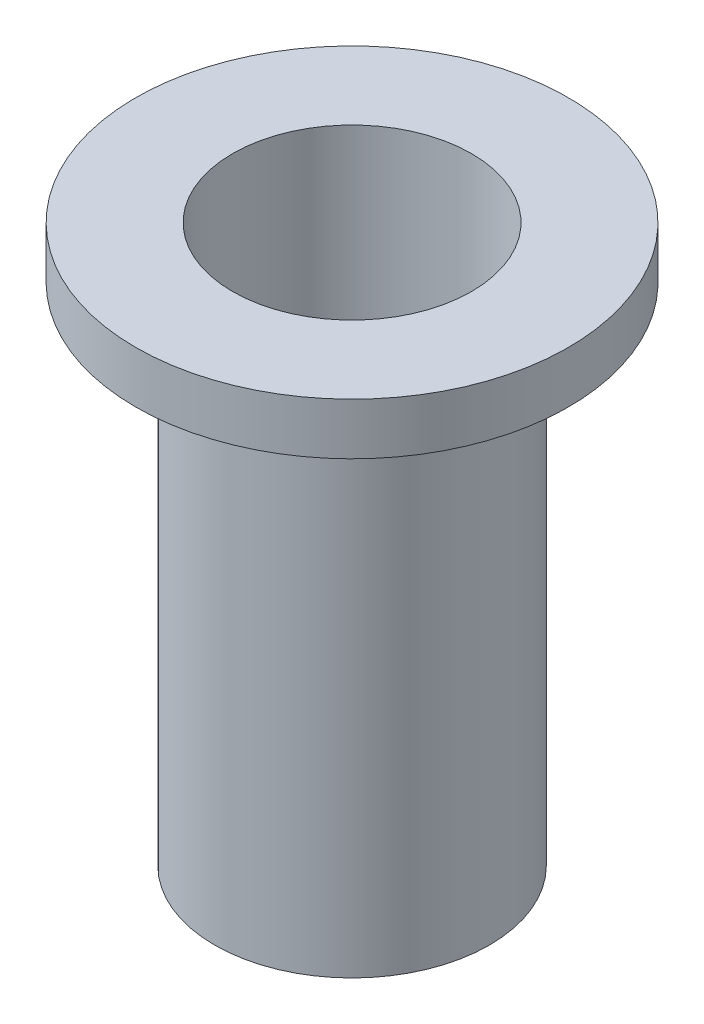
ISO-10303-21;
HEADER;
FILE_DESCRIPTION(('STEP AP214'),'2;1');
FILE_NAME('part.step','',(''),(''),'','','');
FILE_SCHEMA(('AUTOMOTIVE_DESIGN { 1 0 10303 214 1 1 1 1 }'));
ENDSEC;
DATA;
#1=APPLICATION_CONTEXT('core data for automotive mechanical design processes');
#2=APPLICATION_PROTOCOL_DEFINITION('international standard','automotive_design',2000,#1);
#3=PRODUCT_CONTEXT('',#1,'mechanical');
#4=PRODUCT('Part','Part','',(#3));
#5=PRODUCT_RELATED_PRODUCT_CATEGORY('part','',(#4));
#6=PRODUCT_DEFINITION_FORMATION('','',#4);
#7=PRODUCT_DEFINITION_CONTEXT('part definition',#1,'design');
#8=PRODUCT_DEFINITION('design','',#6,#7);
#9=PRODUCT_DEFINITION_SHAPE('','',#8);
#10=(LENGTH_UNIT() NAMED_UNIT(*) SI_UNIT(.MILLI.,.METRE.));
#11=(NAMED_UNIT(*) PLANE_ANGLE_UNIT() SI_UNIT($,.RADIAN.));
#12=(NAMED_UNIT(*) SI_UNIT($,.STERADIAN.) SOLID_ANGLE_UNIT());
#13=UNCERTAINTY_MEASURE_WITH_UNIT(LENGTH_MEASURE(1.E-05),#10,'distance_accuracy_value','');
#14=(GEOMETRIC_REPRESENTATION_CONTEXT(3) GLOBAL_UNCERTAINTY_ASSIGNED_CONTEXT((#13)) GLOBAL_UNIT_ASSIGNED_CONTEXT((#10,
#11,#12)) REPRESENTATION_CONTEXT('',''));
#15=CARTESIAN_POINT('',(0.,0.,0.));
#16=DIRECTION('',(0.,0.,1.));
#17=DIRECTION('',(1.,0.,0.));
#18=AXIS2_PLACEMENT_3D('',#15,#16,#17);
#19=CARTESIAN_POINT('',(0.,0.,0.));
#20=DIRECTION('',(0.,1.,0.));
#21=DIRECTION('',(0.,0.,1.));
#22=AXIS2_PLACEMENT_3D('',#19,#20,#21);
#23=PLANE('',#22);
#24=CARTESIAN_POINT('',(0.,0.,0.));
#25=DIRECTION('',(0.,1.,0.));
#26=DIRECTION('',(0.,0.,1.));
#27=AXIS2_PLACEMENT_3D('',#24,#25,#26);
#28=CIRCLE('',#27,12.7);
#29=CARTESIAN_POINT('',(0.,0.,12.7));
#30=VERTEX_POINT('',#29);
#31=EDGE_CURVE('E34',#30,#30,#28,.T.);
#32=ORIENTED_EDGE('',*,*,#31,.F.);
#33=EDGE_LOOP('',(#32));
#34=FACE_BOUND('',#33,.T.);
#35=CARTESIAN_POINT('',(0.,0.,0.));
#36=DIRECTION('',(0.,1.,0.));
#37=DIRECTION('',(0.,0.,1.));
#38=AXIS2_PLACEMENT_3D('',#35,#36,#37);
#39=CIRCLE('',#38,11.049);
#40=CARTESIAN_POINT('',(0.,0.,11.049));
#41=VERTEX_POINT('',#40);
#42=EDGE_CURVE('E41',#41,#41,#39,.T.);
#43=ORIENTED_EDGE('',*,*,#42,.T.);
#44=EDGE_LOOP('',(#43));
#45=FACE_BOUND('',#44,.T.);
#46=ADVANCED_FACE('F30',(#34,#45),#23,.F.);
#47=CARTESIAN_POINT('',(0.,46.736,0.));
#48=DIRECTION('',(0.,-1.,0.));
#49=DIRECTION('',(0.,0.,-1.));
#50=AXIS2_PLACEMENT_3D('',#47,#48,#49);
#51=CYLINDRICAL_SURFACE('',#50,12.7);
#52=CARTESIAN_POINT('',(0.,46.736,0.));
#53=DIRECTION('',(0.,1.,0.));
#54=DIRECTION('',(0.,0.,1.));
#55=AXIS2_PLACEMENT_3D('',#52,#53,#54);
#56=CIRCLE('',#55,12.7);
#57=CARTESIAN_POINT('',(0.,46.736,12.7));
#58=VERTEX_POINT('',#57);
#59=EDGE_CURVE('E10',#58,#58,#56,.T.);
#60=ORIENTED_EDGE('',*,*,#59,.F.);
#61=EDGE_LOOP('',(#60));
#62=FACE_BOUND('',#61,.T.);
#63=ORIENTED_EDGE('',*,*,#31,.T.);
#64=EDGE_LOOP('',(#63));
#65=FACE_BOUND('',#64,.T.);
#66=ADVANCED_FACE('F32',(#62,#65),#51,.T.);
#67=CARTESIAN_POINT('',(0.,46.736,0.));
#68=DIRECTION('',(0.,-1.,0.));
#69=DIRECTION('',(0.,0.,-1.));
#70=AXIS2_PLACEMENT_3D('',#67,#68,#69);
#71=CYLINDRICAL_SURFACE('',#70,11.049);
#72=ORIENTED_EDGE('',*,*,#42,.F.);
#73=EDGE_LOOP('',(#72));
#74=FACE_BOUND('',#73,.T.);
#75=CARTESIAN_POINT('',(0.,51.5112,0.));
#76=DIRECTION('',(0.,1.,0.));
#77=DIRECTION('',(0.,0.,1.));
#78=AXIS2_PLACEMENT_3D('',#75,#76,#77);
#79=CIRCLE('',#78,11.049);
#80=CARTESIAN_POINT('',(0.,51.5112,11.049));
#81=VERTEX_POINT('',#80);
#82=EDGE_CURVE('E49',#81,#81,#79,.T.);
#83=ORIENTED_EDGE('',*,*,#82,.T.);
#84=EDGE_LOOP('',(#83));
#85=FACE_BOUND('',#84,.T.);
#86=ADVANCED_FACE('F55',(#74,#85),#71,.F.);
#87=CARTESIAN_POINT('',(0.,46.736,0.));
#88=DIRECTION('',(0.,1.,0.));
#89=DIRECTION('',(0.,0.,1.));
#90=AXIS2_PLACEMENT_3D('',#87,#88,#89);
#91=PLANE('',#90);
#92=CARTESIAN_POINT('',(0.,46.736,0.));
#93=DIRECTION('',(0.,1.,0.));
#94=DIRECTION('',(0.,0.,1.));
#95=AXIS2_PLACEMENT_3D('',#92,#93,#94);
#96=CIRCLE('',#95,20.0025);
#97=CARTESIAN_POINT('',(0.,46.736,20.0025));
#98=VERTEX_POINT('',#97);
#99=EDGE_CURVE('E46',#98,#98,#96,.T.);
#100=ORIENTED_EDGE('',*,*,#99,.F.);
#101=EDGE_LOOP('',(#100));
#102=FACE_BOUND('',#101,.T.);
#103=ORIENTED_EDGE('',*,*,#59,.T.);
#104=EDGE_LOOP('',(#103));
#105=FACE_BOUND('',#104,.T.);
#106=ADVANCED_FACE('F60',(#102,#105),#91,.F.);
#107=CARTESIAN_POINT('',(0.,51.5112,0.));
#108=DIRECTION('',(0.,1.,0.));
#109=DIRECTION('',(0.,0.,1.));
#110=AXIS2_PLACEMENT_3D('',#107,#108,#109);
#111=PLANE('',#110);
#112=CARTESIAN_POINT('',(0.,51.5112,0.));
#113=DIRECTION('',(0.,1.,0.));
#114=DIRECTION('',(0.,0.,1.));
#115=AXIS2_PLACEMENT_3D('',#112,#113,#114);
#116=CIRCLE('',#115,20.0025);
#117=CARTESIAN_POINT('',(0.,51.5112,20.0025));
#118=VERTEX_POINT('',#117);
#119=EDGE_CURVE('E45',#118,#118,#116,.T.);
#120=ORIENTED_EDGE('',*,*,#119,.T.);
#121=EDGE_LOOP('',(#120));
#122=FACE_BOUND('',#121,.T.);
#123=ORIENTED_EDGE('',*,*,#82,.F.);
#124=EDGE_LOOP('',(#123));
#125=FACE_BOUND('',#124,.T.);
#126=ADVANCED_FACE('F57',(#122,#125),#111,.T.);
#127=CARTESIAN_POINT('',(0.,51.5112,0.));
#128=DIRECTION('',(0.,-1.,0.));
#129=DIRECTION('',(0.,0.,-1.));
#130=AXIS2_PLACEMENT_3D('',#127,#128,#129);
#131=CYLINDRICAL_SURFACE('',#130,20.0025);
#132=ORIENTED_EDGE('',*,*,#119,.F.);
#133=EDGE_LOOP('',(#132));
#134=FACE_BOUND('',#133,.T.);
#135=ORIENTED_EDGE('',*,*,#99,.T.);
#136=EDGE_LOOP('',(#135));
#137=FACE_BOUND('',#136,.T.);
#138=ADVANCED_FACE('F59',(#134,#137),#131,.T.);
#139=CLOSED_SHELL('',(#46,#66,#86,#106,#126,#138));
#140=MANIFOLD_SOLID_BREP('B2',#139);
#141=ADVANCED_BREP_SHAPE_REPRESENTATION('',(#18,#140),#14);
#142=SHAPE_DEFINITION_REPRESENTATION(#9,#141);
ENDSEC;
END-ISO-10303-21;
